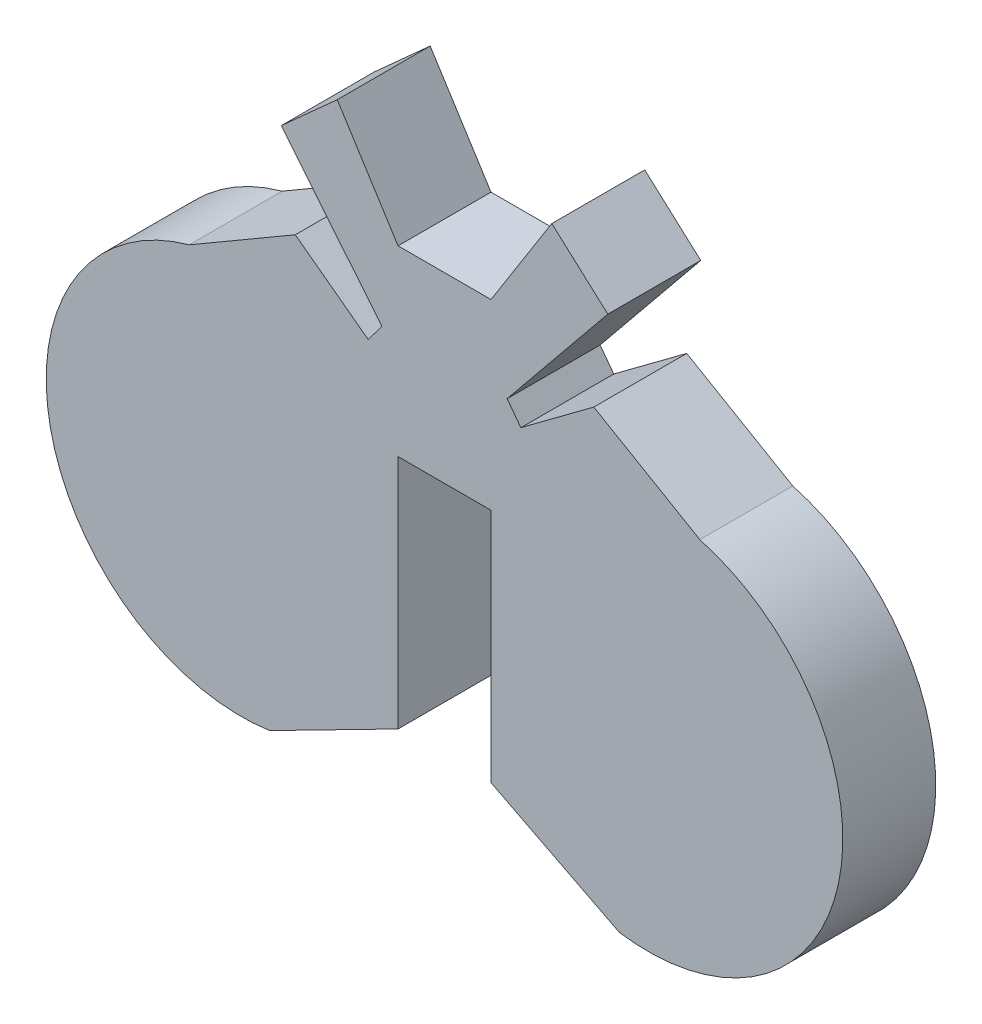
ISO-10303-21;
HEADER;
FILE_DESCRIPTION(('STEP AP214'),'2;1');
FILE_NAME('part.step','',(''),(''),'','','');
FILE_SCHEMA(('AUTOMOTIVE_DESIGN { 1 0 10303 214 1 1 1 1 }'));
ENDSEC;
DATA;
#1=APPLICATION_CONTEXT('core data for automotive mechanical design processes');
#2=APPLICATION_PROTOCOL_DEFINITION('international standard','automotive_design',2000,#1);
#3=PRODUCT_CONTEXT('',#1,'mechanical');
#4=PRODUCT('Part','Part','',(#3));
#5=PRODUCT_RELATED_PRODUCT_CATEGORY('part','',(#4));
#6=PRODUCT_DEFINITION_FORMATION('','',#4);
#7=PRODUCT_DEFINITION_CONTEXT('part definition',#1,'design');
#8=PRODUCT_DEFINITION('design','',#6,#7);
#9=PRODUCT_DEFINITION_SHAPE('','',#8);
#10=(LENGTH_UNIT() NAMED_UNIT(*) SI_UNIT(.MILLI.,.METRE.));
#11=(NAMED_UNIT(*) PLANE_ANGLE_UNIT() SI_UNIT($,.RADIAN.));
#12=(NAMED_UNIT(*) SI_UNIT($,.STERADIAN.) SOLID_ANGLE_UNIT());
#13=UNCERTAINTY_MEASURE_WITH_UNIT(LENGTH_MEASURE(1.E-05),#10,'distance_accuracy_value','');
#14=(GEOMETRIC_REPRESENTATION_CONTEXT(3) GLOBAL_UNCERTAINTY_ASSIGNED_CONTEXT((#13)) GLOBAL_UNIT_ASSIGNED_CONTEXT((#10,
#11,#12)) REPRESENTATION_CONTEXT('',''));
#15=CARTESIAN_POINT('',(0.,0.,0.));
#16=DIRECTION('',(0.,0.,1.));
#17=DIRECTION('',(1.,0.,0.));
#18=AXIS2_PLACEMENT_3D('',#15,#16,#17);
#19=CARTESIAN_POINT('',(-1.5,6.891,-3.));
#20=DIRECTION('',(0.845233853439616,0.534396606463419,0.));
#21=DIRECTION('',(-0.534396606463419,0.845233853439616,0.));
#22=AXIS2_PLACEMENT_3D('',#19,#20,#21);
#23=PLANE('',#22);
#24=DIRECTION('',(-0.534396606463419,0.845233853439616,0.));
#25=VECTOR('',#24,1.);
#26=CARTESIAN_POINT('',(-1.5,6.891,0.));
#27=LINE('',#26,#25);
#28=CARTESIAN_POINT('',(-1.5,6.891,0.));
#29=VERTEX_POINT('',#28);
#30=CARTESIAN_POINT('',(-3.46283873554014,9.99554394368371,0.));
#31=VERTEX_POINT('',#30);
#32=EDGE_CURVE('E193',#29,#31,#27,.T.);
#33=ORIENTED_EDGE('',*,*,#32,.F.);
#34=DIRECTION('',(0.,0.,1.));
#35=VECTOR('',#34,1.);
#36=CARTESIAN_POINT('',(-1.5,6.891,-3.));
#37=LINE('',#36,#35);
#38=CARTESIAN_POINT('',(-1.5,6.891,-3.));
#39=VERTEX_POINT('',#38);
#40=EDGE_CURVE('E11',#39,#29,#37,.T.);
#41=ORIENTED_EDGE('',*,*,#40,.F.);
#42=DIRECTION('',(-0.534396606463419,0.845233853439616,0.));
#43=VECTOR('',#42,1.);
#44=CARTESIAN_POINT('',(-1.5,6.891,-3.));
#45=LINE('',#44,#43);
#46=CARTESIAN_POINT('',(-3.46283873554014,9.99554394368371,-3.));
#47=VERTEX_POINT('',#46);
#48=EDGE_CURVE('E247',#39,#47,#45,.T.);
#49=ORIENTED_EDGE('',*,*,#48,.T.);
#50=DIRECTION('',(0.,0.,1.));
#51=VECTOR('',#50,1.);
#52=CARTESIAN_POINT('',(-3.46283873554014,9.99554394368371,-3.));
#53=LINE('',#52,#51);
#54=EDGE_CURVE('E35',#47,#31,#53,.T.);
#55=ORIENTED_EDGE('',*,*,#54,.T.);
#56=EDGE_LOOP('',(#33,#41,#49,#55));
#57=FACE_BOUND('',#56,.T.);
#58=ADVANCED_FACE('F32',(#57),#23,.T.);
#59=CARTESIAN_POINT('',(1.5,6.891,-3.));
#60=DIRECTION('',(0.,1.,0.));
#61=DIRECTION('',(0.,0.,1.));
#62=AXIS2_PLACEMENT_3D('',#59,#60,#61);
#63=PLANE('',#62);
#64=DIRECTION('',(-1.,0.,0.));
#65=VECTOR('',#64,1.);
#66=CARTESIAN_POINT('',(1.5,6.891,0.));
#67=LINE('',#66,#65);
#68=CARTESIAN_POINT('',(1.5,6.891,0.));
#69=VERTEX_POINT('',#68);
#70=EDGE_CURVE('E245',#69,#29,#67,.T.);
#71=ORIENTED_EDGE('',*,*,#70,.F.);
#72=DIRECTION('',(0.,0.,1.));
#73=VECTOR('',#72,1.);
#74=CARTESIAN_POINT('',(1.5,6.891,-3.));
#75=LINE('',#74,#73);
#76=CARTESIAN_POINT('',(1.5,6.891,-3.));
#77=VERTEX_POINT('',#76);
#78=EDGE_CURVE('E41',#77,#69,#75,.T.);
#79=ORIENTED_EDGE('',*,*,#78,.F.);
#80=DIRECTION('',(-1.,0.,0.));
#81=VECTOR('',#80,1.);
#82=CARTESIAN_POINT('',(1.5,6.891,-3.));
#83=LINE('',#82,#81);
#84=EDGE_CURVE('E183',#77,#39,#83,.T.);
#85=ORIENTED_EDGE('',*,*,#84,.T.);
#86=ORIENTED_EDGE('',*,*,#40,.T.);
#87=EDGE_LOOP('',(#71,#79,#85,#86));
#88=FACE_BOUND('',#87,.T.);
#89=ADVANCED_FACE('F279',(#88),#63,.T.);
#90=CARTESIAN_POINT('',(1.5,6.891,-3.));
#91=DIRECTION('',(-0.845233853439616,0.534396606463419,0.));
#92=DIRECTION('',(-0.534396606463419,-0.845233853439616,0.));
#93=AXIS2_PLACEMENT_3D('',#90,#91,#92);
#94=PLANE('',#93);
#95=DIRECTION('',(-0.534396606463419,-0.845233853439616,0.));
#96=VECTOR('',#95,1.);
#97=CARTESIAN_POINT('',(1.5,6.891,0.));
#98=LINE('',#97,#96);
#99=CARTESIAN_POINT('',(3.46283873554014,9.99554394368371,0.));
#100=VERTEX_POINT('',#99);
#101=EDGE_CURVE('E169',#100,#69,#98,.T.);
#102=ORIENTED_EDGE('',*,*,#101,.F.);
#103=DIRECTION('',(0.,0.,1.));
#104=VECTOR('',#103,1.);
#105=CARTESIAN_POINT('',(3.46283873554014,9.99554394368371,-3.));
#106=LINE('',#105,#104);
#107=CARTESIAN_POINT('',(3.46283873554014,9.99554394368371,-3.));
#108=VERTEX_POINT('',#107);
#109=EDGE_CURVE('E164',#108,#100,#106,.T.);
#110=ORIENTED_EDGE('',*,*,#109,.F.);
#111=DIRECTION('',(-0.534396606463419,-0.845233853439616,0.));
#112=VECTOR('',#111,1.);
#113=CARTESIAN_POINT('',(1.5,6.891,-3.));
#114=LINE('',#113,#112);
#115=EDGE_CURVE('E167',#108,#77,#114,.T.);
#116=ORIENTED_EDGE('',*,*,#115,.T.);
#117=ORIENTED_EDGE('',*,*,#78,.T.);
#118=EDGE_LOOP('',(#102,#110,#116,#117));
#119=FACE_BOUND('',#118,.T.);
#120=ADVANCED_FACE('F166',(#119),#94,.T.);
#121=CARTESIAN_POINT('',(3.46283873554014,9.99554394368371,-3.));
#122=DIRECTION('',(0.669519624338816,0.742794367658513,0.));
#123=DIRECTION('',(-0.742794367658513,0.669519624338817,0.));
#124=AXIS2_PLACEMENT_3D('',#121,#122,#123);
#125=PLANE('',#124);
#126=DIRECTION('',(-0.742794367658513,0.669519624338817,0.));
#127=VECTOR('',#126,1.);
#128=CARTESIAN_POINT('',(3.46283873554014,9.99554394368371,0.));
#129=LINE('',#128,#127);
#130=CARTESIAN_POINT('',(5.2700574320533,8.36660269766737,0.));
#131=VERTEX_POINT('',#130);
#132=EDGE_CURVE('E242',#131,#100,#129,.T.);
#133=ORIENTED_EDGE('',*,*,#132,.F.);
#134=DIRECTION('',(0.,0.,1.));
#135=VECTOR('',#134,1.);
#136=CARTESIAN_POINT('',(5.2700574320533,8.36660269766737,-3.));
#137=LINE('',#136,#135);
#138=CARTESIAN_POINT('',(5.2700574320533,8.36660269766737,-3.));
#139=VERTEX_POINT('',#138);
#140=EDGE_CURVE('E174',#139,#131,#137,.T.);
#141=ORIENTED_EDGE('',*,*,#140,.F.);
#142=DIRECTION('',(-0.742794367658513,0.669519624338817,0.));
#143=VECTOR('',#142,1.);
#144=CARTESIAN_POINT('',(3.46283873554014,9.99554394368371,-3.));
#145=LINE('',#144,#143);
#146=EDGE_CURVE('E181',#139,#108,#145,.T.);
#147=ORIENTED_EDGE('',*,*,#146,.T.);
#148=ORIENTED_EDGE('',*,*,#109,.T.);
#149=EDGE_LOOP('',(#133,#141,#147,#148));
#150=FACE_BOUND('',#149,.T.);
#151=ADVANCED_FACE('F185',(#150),#125,.T.);
#152=CARTESIAN_POINT('',(5.2700574320533,8.36660269766737,-3.));
#153=DIRECTION('',(0.775286336021219,-0.631609924857735,0.));
#154=DIRECTION('',(0.631609924857735,0.775286336021219,0.));
#155=AXIS2_PLACEMENT_3D('',#152,#153,#154);
#156=PLANE('',#155);
#157=DIRECTION('',(0.631609924857735,0.775286336021219,0.));
#158=VECTOR('',#157,1.);
#159=CARTESIAN_POINT('',(5.2700574320533,8.36660269766737,0.));
#160=LINE('',#159,#158);
#161=CARTESIAN_POINT('',(2.02231919843483,4.38008035784626,0.));
#162=VERTEX_POINT('',#161);
#163=EDGE_CURVE('E239',#162,#131,#160,.T.);
#164=ORIENTED_EDGE('',*,*,#163,.F.);
#165=DIRECTION('',(0.,0.,1.));
#166=VECTOR('',#165,1.);
#167=CARTESIAN_POINT('',(2.02231919843483,4.38008035784626,-3.));
#168=LINE('',#167,#166);
#169=CARTESIAN_POINT('',(2.02231919843483,4.38008035784626,-3.));
#170=VERTEX_POINT('',#169);
#171=EDGE_CURVE('E251',#170,#162,#168,.T.);
#172=ORIENTED_EDGE('',*,*,#171,.F.);
#173=DIRECTION('',(0.631609924857735,0.775286336021219,0.));
#174=VECTOR('',#173,1.);
#175=CARTESIAN_POINT('',(5.2700574320533,8.36660269766737,-3.));
#176=LINE('',#175,#174);
#177=EDGE_CURVE('E186',#170,#139,#176,.T.);
#178=ORIENTED_EDGE('',*,*,#177,.T.);
#179=ORIENTED_EDGE('',*,*,#140,.T.);
#180=EDGE_LOOP('',(#164,#172,#178,#179));
#181=FACE_BOUND('',#180,.T.);
#182=ADVANCED_FACE('F292',(#181),#156,.T.);
#183=CARTESIAN_POINT('',(2.02231919843483,4.38008035784626,-3.));
#184=DIRECTION('',(0.80205717942544,0.597247252762294,0.));
#185=DIRECTION('',(-0.597247252762294,0.80205717942544,0.));
#186=AXIS2_PLACEMENT_3D('',#183,#184,#185);
#187=PLANE('',#186);
#188=DIRECTION('',(-0.597247252762294,0.80205717942544,0.));
#189=VECTOR('',#188,1.);
#190=CARTESIAN_POINT('',(2.02231919843483,4.38008035784626,0.));
#191=LINE('',#190,#189);
#192=CARTESIAN_POINT('',(2.46249042372064,3.78896421660971,0.));
#193=VERTEX_POINT('',#192);
#194=EDGE_CURVE('E236',#193,#162,#191,.T.);
#195=ORIENTED_EDGE('',*,*,#194,.F.);
#196=DIRECTION('',(0.,0.,1.));
#197=VECTOR('',#196,1.);
#198=CARTESIAN_POINT('',(2.46249042372064,3.78896421660971,-3.));
#199=LINE('',#198,#197);
#200=CARTESIAN_POINT('',(2.46249042372064,3.78896421660971,-3.));
#201=VERTEX_POINT('',#200);
#202=EDGE_CURVE('E253',#201,#193,#199,.T.);
#203=ORIENTED_EDGE('',*,*,#202,.F.);
#204=DIRECTION('',(-0.597247252762294,0.80205717942544,0.));
#205=VECTOR('',#204,1.);
#206=CARTESIAN_POINT('',(2.02231919843483,4.38008035784626,-3.));
#207=LINE('',#206,#205);
#208=EDGE_CURVE('E188',#201,#170,#207,.T.);
#209=ORIENTED_EDGE('',*,*,#208,.T.);
#210=ORIENTED_EDGE('',*,*,#171,.T.);
#211=EDGE_LOOP('',(#195,#203,#209,#210));
#212=FACE_BOUND('',#211,.T.);
#213=ADVANCED_FACE('F295',(#212),#187,.T.);
#214=CARTESIAN_POINT('',(2.46249042372064,3.78896421660971,-3.));
#215=DIRECTION('',(-0.597247252762298,0.802057179425437,0.));
#216=DIRECTION('',(-0.802057179425437,-0.597247252762298,0.));
#217=AXIS2_PLACEMENT_3D('',#214,#215,#216);
#218=PLANE('',#217);
#219=DIRECTION('',(-0.802057179425437,-0.597247252762298,0.));
#220=VECTOR('',#219,1.);
#221=CARTESIAN_POINT('',(2.46249042372064,3.78896421660971,0.));
#222=LINE('',#221,#220);
#223=CARTESIAN_POINT('',(4.8165282453343,5.54188490346705,0.));
#224=VERTEX_POINT('',#223);
#225=EDGE_CURVE('E233',#224,#193,#222,.T.);
#226=ORIENTED_EDGE('',*,*,#225,.F.);
#227=DIRECTION('',(0.,0.,1.));
#228=VECTOR('',#227,1.);
#229=CARTESIAN_POINT('',(4.8165282453343,5.54188490346705,-3.));
#230=LINE('',#229,#228);
#231=CARTESIAN_POINT('',(4.8165282453343,5.54188490346705,-3.));
#232=VERTEX_POINT('',#231);
#233=EDGE_CURVE('E255',#232,#224,#230,.T.);
#234=ORIENTED_EDGE('',*,*,#233,.F.);
#235=DIRECTION('',(-0.802057179425437,-0.597247252762298,0.));
#236=VECTOR('',#235,1.);
#237=CARTESIAN_POINT('',(2.46249042372064,3.78896421660971,-3.));
#238=LINE('',#237,#236);
#239=EDGE_CURVE('E418',#232,#201,#238,.T.);
#240=ORIENTED_EDGE('',*,*,#239,.T.);
#241=ORIENTED_EDGE('',*,*,#202,.T.);
#242=EDGE_LOOP('',(#226,#234,#240,#241));
#243=FACE_BOUND('',#242,.T.);
#244=ADVANCED_FACE('F299',(#243),#218,.T.);
#245=CARTESIAN_POINT('',(4.8165282453343,5.54188490346705,-3.));
#246=DIRECTION('',(0.503095366919462,0.864230901891486,0.));
#247=DIRECTION('',(-0.864230901891486,0.503095366919462,0.));
#248=AXIS2_PLACEMENT_3D('',#245,#246,#247);
#249=PLANE('',#248);
#250=DIRECTION('',(-0.864230901891486,0.503095366919462,0.));
#251=VECTOR('',#250,1.);
#252=CARTESIAN_POINT('',(4.8165282453343,5.54188490346705,0.));
#253=LINE('',#252,#251);
#254=CARTESIAN_POINT('',(8.24061107862836,3.54862105973214,0.));
#255=VERTEX_POINT('',#254);
#256=EDGE_CURVE('E230',#255,#224,#253,.T.);
#257=ORIENTED_EDGE('',*,*,#256,.F.);
#258=DIRECTION('',(0.,0.,1.));
#259=VECTOR('',#258,1.);
#260=CARTESIAN_POINT('',(8.24061107862836,3.54862105973214,-3.));
#261=LINE('',#260,#259);
#262=CARTESIAN_POINT('',(8.24061107862836,3.54862105973214,-3.));
#263=VERTEX_POINT('',#262);
#264=EDGE_CURVE('E257',#263,#255,#261,.T.);
#265=ORIENTED_EDGE('',*,*,#264,.F.);
#266=DIRECTION('',(-0.864230901891486,0.503095366919462,0.));
#267=VECTOR('',#266,1.);
#268=CARTESIAN_POINT('',(4.8165282453343,5.54188490346705,-3.));
#269=LINE('',#268,#267);
#270=EDGE_CURVE('E415',#263,#232,#269,.T.);
#271=ORIENTED_EDGE('',*,*,#270,.T.);
#272=ORIENTED_EDGE('',*,*,#233,.T.);
#273=EDGE_LOOP('',(#257,#265,#271,#272));
#274=FACE_BOUND('',#273,.T.);
#275=ADVANCED_FACE('F303',(#274),#249,.T.);
#276=CARTESIAN_POINT('',(6.56888640009041,-2.51204768217804,-3.));
#277=DIRECTION('',(0.,0.,1.));
#278=DIRECTION('',(1.,0.,0.));
#279=AXIS2_PLACEMENT_3D('',#276,#277,#278);
#280=CYLINDRICAL_SURFACE('',#279,6.287);
#281=CARTESIAN_POINT('',(6.56888640009041,-2.51204768217804,0.));
#282=DIRECTION('',(0.,0.,1.));
#283=DIRECTION('',(-1.,0.,0.));
#284=AXIS2_PLACEMENT_3D('',#281,#282,#283);
#285=CIRCLE('',#284,6.287);
#286=CARTESIAN_POINT('',(5.64267455943129,-8.73044784831586,0.));
#287=VERTEX_POINT('',#286);
#288=EDGE_CURVE('E227',#287,#255,#285,.T.);
#289=ORIENTED_EDGE('',*,*,#288,.F.);
#290=DIRECTION('',(0.,0.,1.));
#291=VECTOR('',#290,1.);
#292=CARTESIAN_POINT('',(5.64267455943129,-8.73044784831586,-3.));
#293=LINE('',#292,#291);
#294=CARTESIAN_POINT('',(5.64267455943129,-8.73044784831586,-3.));
#295=VERTEX_POINT('',#294);
#296=EDGE_CURVE('E259',#295,#287,#293,.T.);
#297=ORIENTED_EDGE('',*,*,#296,.F.);
#298=CARTESIAN_POINT('',(6.56888640009041,-2.51204768217804,-3.));
#299=DIRECTION('',(0.,0.,1.));
#300=DIRECTION('',(-1.,0.,0.));
#301=AXIS2_PLACEMENT_3D('',#298,#299,#300);
#302=CIRCLE('',#301,6.287);
#303=EDGE_CURVE('E412',#295,#263,#302,.T.);
#304=ORIENTED_EDGE('',*,*,#303,.T.);
#305=ORIENTED_EDGE('',*,*,#264,.T.);
#306=EDGE_LOOP('',(#289,#297,#304,#305));
#307=FACE_BOUND('',#306,.T.);
#308=ADVANCED_FACE('F307',(#307),#280,.T.);
#309=CARTESIAN_POINT('',(1.5,-6.614,-3.));
#310=DIRECTION('',(-0.454954395596702,-0.890514737624953,0.));
#311=DIRECTION('',(0.890514737624954,-0.454954395596702,0.));
#312=AXIS2_PLACEMENT_3D('',#309,#310,#311);
#313=PLANE('',#312);
#314=DIRECTION('',(0.890514737624953,-0.454954395596702,0.));
#315=VECTOR('',#314,1.);
#316=CARTESIAN_POINT('',(1.5,-6.614,0.));
#317=LINE('',#316,#315);
#318=CARTESIAN_POINT('',(1.5,-6.614,0.));
#319=VERTEX_POINT('',#318);
#320=EDGE_CURVE('E224',#319,#287,#317,.T.);
#321=ORIENTED_EDGE('',*,*,#320,.F.);
#322=DIRECTION('',(0.,0.,1.));
#323=VECTOR('',#322,1.);
#324=CARTESIAN_POINT('',(1.5,-6.614,-3.));
#325=LINE('',#324,#323);
#326=CARTESIAN_POINT('',(1.5,-6.614,-3.));
#327=VERTEX_POINT('',#326);
#328=EDGE_CURVE('E261',#327,#319,#325,.T.);
#329=ORIENTED_EDGE('',*,*,#328,.F.);
#330=DIRECTION('',(0.890514737624953,-0.454954395596702,0.));
#331=VECTOR('',#330,1.);
#332=CARTESIAN_POINT('',(1.5,-6.614,-3.));
#333=LINE('',#332,#331);
#334=EDGE_CURVE('E409',#327,#295,#333,.T.);
#335=ORIENTED_EDGE('',*,*,#334,.T.);
#336=ORIENTED_EDGE('',*,*,#296,.T.);
#337=EDGE_LOOP('',(#321,#329,#335,#336));
#338=FACE_BOUND('',#337,.T.);
#339=ADVANCED_FACE('F311',(#338),#313,.T.);
#340=CARTESIAN_POINT('',(1.5,0.,-3.));
#341=DIRECTION('',(-1.,0.,0.));
#342=DIRECTION('',(0.,-1.,0.));
#343=AXIS2_PLACEMENT_3D('',#340,#341,#342);
#344=PLANE('',#343);
#345=DIRECTION('',(0.,-1.,0.));
#346=VECTOR('',#345,1.);
#347=CARTESIAN_POINT('',(1.5,0.,0.));
#348=LINE('',#347,#346);
#349=CARTESIAN_POINT('',(1.5,1.,0.));
#350=VERTEX_POINT('',#349);
#351=EDGE_CURVE('E221',#350,#319,#348,.T.);
#352=ORIENTED_EDGE('',*,*,#351,.F.);
#353=DIRECTION('',(0.,0.,1.));
#354=VECTOR('',#353,1.);
#355=CARTESIAN_POINT('',(1.5,1.,-10.));
#356=LINE('',#355,#354);
#357=CARTESIAN_POINT('',(1.5,1.,-3.));
#358=VERTEX_POINT('',#357);
#359=EDGE_CURVE('E366',#358,#350,#356,.T.);
#360=ORIENTED_EDGE('',*,*,#359,.F.);
#361=DIRECTION('',(0.,-1.,0.));
#362=VECTOR('',#361,1.);
#363=CARTESIAN_POINT('',(1.5,0.,-3.));
#364=LINE('',#363,#362);
#365=EDGE_CURVE('E407',#358,#327,#364,.T.);
#366=ORIENTED_EDGE('',*,*,#365,.T.);
#367=ORIENTED_EDGE('',*,*,#328,.T.);
#368=EDGE_LOOP('',(#352,#360,#366,#367));
#369=FACE_BOUND('',#368,.T.);
#370=ADVANCED_FACE('F315',(#369),#344,.T.);
#371=CARTESIAN_POINT('',(-1.5,0.,-3.));
#372=DIRECTION('',(1.,0.,0.));
#373=DIRECTION('',(0.,1.,0.));
#374=AXIS2_PLACEMENT_3D('',#371,#372,#373);
#375=PLANE('',#374);
#376=DIRECTION('',(0.,1.,0.));
#377=VECTOR('',#376,1.);
#378=CARTESIAN_POINT('',(-1.5,0.,0.));
#379=LINE('',#378,#377);
#380=CARTESIAN_POINT('',(-1.5,-6.614,0.));
#381=VERTEX_POINT('',#380);
#382=CARTESIAN_POINT('',(-1.5,1.,0.));
#383=VERTEX_POINT('',#382);
#384=EDGE_CURVE('E218',#381,#383,#379,.T.);
#385=ORIENTED_EDGE('',*,*,#384,.F.);
#386=DIRECTION('',(0.,0.,1.));
#387=VECTOR('',#386,1.);
#388=CARTESIAN_POINT('',(-1.5,-6.614,-3.));
#389=LINE('',#388,#387);
#390=CARTESIAN_POINT('',(-1.5,-6.614,-3.));
#391=VERTEX_POINT('',#390);
#392=EDGE_CURVE('E263',#391,#381,#389,.T.);
#393=ORIENTED_EDGE('',*,*,#392,.F.);
#394=DIRECTION('',(0.,1.,0.));
#395=VECTOR('',#394,1.);
#396=CARTESIAN_POINT('',(-1.5,0.,-3.));
#397=LINE('',#396,#395);
#398=CARTESIAN_POINT('',(-1.5,1.,-3.));
#399=VERTEX_POINT('',#398);
#400=EDGE_CURVE('E404',#391,#399,#397,.T.);
#401=ORIENTED_EDGE('',*,*,#400,.T.);
#402=DIRECTION('',(0.,0.,1.));
#403=VECTOR('',#402,1.);
#404=CARTESIAN_POINT('',(-1.5,1.,-10.));
#405=LINE('',#404,#403);
#406=EDGE_CURVE('E375',#399,#383,#405,.T.);
#407=ORIENTED_EDGE('',*,*,#406,.T.);
#408=EDGE_LOOP('',(#385,#393,#401,#407));
#409=FACE_BOUND('',#408,.T.);
#410=ADVANCED_FACE('F319',(#409),#375,.T.);
#411=CARTESIAN_POINT('',(-1.5,-6.614,-3.));
#412=DIRECTION('',(0.454954395596702,-0.890514737624953,0.));
#413=DIRECTION('',(0.890514737624954,0.454954395596702,0.));
#414=AXIS2_PLACEMENT_3D('',#411,#412,#413);
#415=PLANE('',#414);
#416=DIRECTION('',(0.890514737624953,0.454954395596702,0.));
#417=VECTOR('',#416,1.);
#418=CARTESIAN_POINT('',(-1.5,-6.614,0.));
#419=LINE('',#418,#417);
#420=CARTESIAN_POINT('',(-5.64267455943128,-8.73044784831586,0.));
#421=VERTEX_POINT('',#420);
#422=EDGE_CURVE('E215',#421,#381,#419,.T.);
#423=ORIENTED_EDGE('',*,*,#422,.F.);
#424=DIRECTION('',(0.,0.,1.));
#425=VECTOR('',#424,1.);
#426=CARTESIAN_POINT('',(-5.64267455943128,-8.73044784831586,-3.));
#427=LINE('',#426,#425);
#428=CARTESIAN_POINT('',(-5.64267455943128,-8.73044784831586,-3.));
#429=VERTEX_POINT('',#428);
#430=EDGE_CURVE('E265',#429,#421,#427,.T.);
#431=ORIENTED_EDGE('',*,*,#430,.F.);
#432=DIRECTION('',(0.890514737624953,0.454954395596702,0.));
#433=VECTOR('',#432,1.);
#434=CARTESIAN_POINT('',(-1.5,-6.614,-3.));
#435=LINE('',#434,#433);
#436=EDGE_CURVE('E401',#429,#391,#435,.T.);
#437=ORIENTED_EDGE('',*,*,#436,.T.);
#438=ORIENTED_EDGE('',*,*,#392,.T.);
#439=EDGE_LOOP('',(#423,#431,#437,#438));
#440=FACE_BOUND('',#439,.T.);
#441=ADVANCED_FACE('F323',(#440),#415,.T.);
#442=CARTESIAN_POINT('',(-6.56888640009041,-2.51204768217804,-3.));
#443=DIRECTION('',(0.,0.,1.));
#444=DIRECTION('',(1.,0.,0.));
#445=AXIS2_PLACEMENT_3D('',#442,#443,#444);
#446=CYLINDRICAL_SURFACE('',#445,6.287);
#447=CARTESIAN_POINT('',(-6.56888640009041,-2.51204768217804,0.));
#448=DIRECTION('',(0.,0.,1.));
#449=DIRECTION('',(1.,0.,0.));
#450=AXIS2_PLACEMENT_3D('',#447,#448,#449);
#451=CIRCLE('',#450,6.287);
#452=CARTESIAN_POINT('',(-8.24061107862836,3.54862105973214,0.));
#453=VERTEX_POINT('',#452);
#454=EDGE_CURVE('E212',#453,#421,#451,.T.);
#455=ORIENTED_EDGE('',*,*,#454,.F.);
#456=DIRECTION('',(0.,0.,1.));
#457=VECTOR('',#456,1.);
#458=CARTESIAN_POINT('',(-8.24061107862836,3.54862105973214,-3.));
#459=LINE('',#458,#457);
#460=CARTESIAN_POINT('',(-8.24061107862836,3.54862105973214,-3.));
#461=VERTEX_POINT('',#460);
#462=EDGE_CURVE('E267',#461,#453,#459,.T.);
#463=ORIENTED_EDGE('',*,*,#462,.F.);
#464=CARTESIAN_POINT('',(-6.56888640009041,-2.51204768217804,-3.));
#465=DIRECTION('',(0.,0.,1.));
#466=DIRECTION('',(1.,0.,0.));
#467=AXIS2_PLACEMENT_3D('',#464,#465,#466);
#468=CIRCLE('',#467,6.287);
#469=EDGE_CURVE('E398',#461,#429,#468,.T.);
#470=ORIENTED_EDGE('',*,*,#469,.T.);
#471=ORIENTED_EDGE('',*,*,#430,.T.);
#472=EDGE_LOOP('',(#455,#463,#470,#471));
#473=FACE_BOUND('',#472,.T.);
#474=ADVANCED_FACE('F327',(#473),#446,.T.);
#475=CARTESIAN_POINT('',(-4.8165282453343,5.54188490346705,-3.));
#476=DIRECTION('',(-0.503095366919462,0.864230901891486,0.));
#477=DIRECTION('',(-0.864230901891486,-0.503095366919462,0.));
#478=AXIS2_PLACEMENT_3D('',#475,#476,#477);
#479=PLANE('',#478);
#480=DIRECTION('',(-0.864230901891486,-0.503095366919462,0.));
#481=VECTOR('',#480,1.);
#482=CARTESIAN_POINT('',(-4.8165282453343,5.54188490346705,0.));
#483=LINE('',#482,#481);
#484=CARTESIAN_POINT('',(-4.8165282453343,5.54188490346705,0.));
#485=VERTEX_POINT('',#484);
#486=EDGE_CURVE('E209',#485,#453,#483,.T.);
#487=ORIENTED_EDGE('',*,*,#486,.F.);
#488=DIRECTION('',(0.,0.,1.));
#489=VECTOR('',#488,1.);
#490=CARTESIAN_POINT('',(-4.8165282453343,5.54188490346705,-3.));
#491=LINE('',#490,#489);
#492=CARTESIAN_POINT('',(-4.8165282453343,5.54188490346705,-3.));
#493=VERTEX_POINT('',#492);
#494=EDGE_CURVE('E269',#493,#485,#491,.T.);
#495=ORIENTED_EDGE('',*,*,#494,.F.);
#496=DIRECTION('',(-0.864230901891486,-0.503095366919462,0.));
#497=VECTOR('',#496,1.);
#498=CARTESIAN_POINT('',(-4.8165282453343,5.54188490346705,-3.));
#499=LINE('',#498,#497);
#500=EDGE_CURVE('E395',#493,#461,#499,.T.);
#501=ORIENTED_EDGE('',*,*,#500,.T.);
#502=ORIENTED_EDGE('',*,*,#462,.T.);
#503=EDGE_LOOP('',(#487,#495,#501,#502));
#504=FACE_BOUND('',#503,.T.);
#505=ADVANCED_FACE('F331',(#504),#479,.T.);
#506=CARTESIAN_POINT('',(-2.46249042372064,3.78896421660971,-3.));
#507=DIRECTION('',(0.597247252762298,0.802057179425437,0.));
#508=DIRECTION('',(-0.802057179425437,0.597247252762298,0.));
#509=AXIS2_PLACEMENT_3D('',#506,#507,#508);
#510=PLANE('',#509);
#511=DIRECTION('',(-0.802057179425437,0.597247252762298,0.));
#512=VECTOR('',#511,1.);
#513=CARTESIAN_POINT('',(-2.46249042372064,3.78896421660971,0.));
#514=LINE('',#513,#512);
#515=CARTESIAN_POINT('',(-2.46249042372064,3.78896421660971,0.));
#516=VERTEX_POINT('',#515);
#517=EDGE_CURVE('E206',#516,#485,#514,.T.);
#518=ORIENTED_EDGE('',*,*,#517,.F.);
#519=DIRECTION('',(0.,0.,1.));
#520=VECTOR('',#519,1.);
#521=CARTESIAN_POINT('',(-2.46249042372064,3.78896421660971,-3.));
#522=LINE('',#521,#520);
#523=CARTESIAN_POINT('',(-2.46249042372064,3.78896421660971,-3.));
#524=VERTEX_POINT('',#523);
#525=EDGE_CURVE('E271',#524,#516,#522,.T.);
#526=ORIENTED_EDGE('',*,*,#525,.F.);
#527=DIRECTION('',(-0.802057179425437,0.597247252762298,0.));
#528=VECTOR('',#527,1.);
#529=CARTESIAN_POINT('',(-2.46249042372064,3.78896421660971,-3.));
#530=LINE('',#529,#528);
#531=EDGE_CURVE('E392',#524,#493,#530,.T.);
#532=ORIENTED_EDGE('',*,*,#531,.T.);
#533=ORIENTED_EDGE('',*,*,#494,.T.);
#534=EDGE_LOOP('',(#518,#526,#532,#533));
#535=FACE_BOUND('',#534,.T.);
#536=ADVANCED_FACE('F335',(#535),#510,.T.);
#537=CARTESIAN_POINT('',(-2.02231919843483,4.38008035784626,-3.));
#538=DIRECTION('',(-0.80205717942544,0.597247252762294,0.));
#539=DIRECTION('',(-0.597247252762294,-0.80205717942544,0.));
#540=AXIS2_PLACEMENT_3D('',#537,#538,#539);
#541=PLANE('',#540);
#542=DIRECTION('',(-0.597247252762294,-0.80205717942544,0.));
#543=VECTOR('',#542,1.);
#544=CARTESIAN_POINT('',(-2.02231919843483,4.38008035784626,0.));
#545=LINE('',#544,#543);
#546=CARTESIAN_POINT('',(-2.02231919843483,4.38008035784626,0.));
#547=VERTEX_POINT('',#546);
#548=EDGE_CURVE('E203',#547,#516,#545,.T.);
#549=ORIENTED_EDGE('',*,*,#548,.F.);
#550=DIRECTION('',(0.,0.,1.));
#551=VECTOR('',#550,1.);
#552=CARTESIAN_POINT('',(-2.02231919843483,4.38008035784626,-3.));
#553=LINE('',#552,#551);
#554=CARTESIAN_POINT('',(-2.02231919843483,4.38008035784626,-3.));
#555=VERTEX_POINT('',#554);
#556=EDGE_CURVE('E273',#555,#547,#553,.T.);
#557=ORIENTED_EDGE('',*,*,#556,.F.);
#558=DIRECTION('',(-0.597247252762294,-0.80205717942544,0.));
#559=VECTOR('',#558,1.);
#560=CARTESIAN_POINT('',(-2.02231919843483,4.38008035784626,-3.));
#561=LINE('',#560,#559);
#562=EDGE_CURVE('E389',#555,#524,#561,.T.);
#563=ORIENTED_EDGE('',*,*,#562,.T.);
#564=ORIENTED_EDGE('',*,*,#525,.T.);
#565=EDGE_LOOP('',(#549,#557,#563,#564));
#566=FACE_BOUND('',#565,.T.);
#567=ADVANCED_FACE('F339',(#566),#541,.T.);
#568=CARTESIAN_POINT('',(-5.2700574320533,8.36660269766737,-3.));
#569=DIRECTION('',(-0.775286336021219,-0.631609924857735,0.));
#570=DIRECTION('',(0.631609924857735,-0.775286336021219,0.));
#571=AXIS2_PLACEMENT_3D('',#568,#569,#570);
#572=PLANE('',#571);
#573=DIRECTION('',(0.631609924857735,-0.775286336021219,0.));
#574=VECTOR('',#573,1.);
#575=CARTESIAN_POINT('',(-5.2700574320533,8.36660269766737,0.));
#576=LINE('',#575,#574);
#577=CARTESIAN_POINT('',(-5.2700574320533,8.36660269766737,0.));
#578=VERTEX_POINT('',#577);
#579=EDGE_CURVE('E200',#578,#547,#576,.T.);
#580=ORIENTED_EDGE('',*,*,#579,.F.);
#581=DIRECTION('',(0.,0.,1.));
#582=VECTOR('',#581,1.);
#583=CARTESIAN_POINT('',(-5.2700574320533,8.36660269766737,-3.));
#584=LINE('',#583,#582);
#585=CARTESIAN_POINT('',(-5.2700574320533,8.36660269766737,-3.));
#586=VERTEX_POINT('',#585);
#587=EDGE_CURVE('E274',#586,#578,#584,.T.);
#588=ORIENTED_EDGE('',*,*,#587,.F.);
#589=DIRECTION('',(0.631609924857735,-0.775286336021219,0.));
#590=VECTOR('',#589,1.);
#591=CARTESIAN_POINT('',(-5.2700574320533,8.36660269766737,-3.));
#592=LINE('',#591,#590);
#593=EDGE_CURVE('E386',#586,#555,#592,.T.);
#594=ORIENTED_EDGE('',*,*,#593,.T.);
#595=ORIENTED_EDGE('',*,*,#556,.T.);
#596=EDGE_LOOP('',(#580,#588,#594,#595));
#597=FACE_BOUND('',#596,.T.);
#598=ADVANCED_FACE('F343',(#597),#572,.T.);
#599=CARTESIAN_POINT('',(-3.46283873554014,9.99554394368371,-3.));
#600=DIRECTION('',(-0.669519624338816,0.742794367658513,0.));
#601=DIRECTION('',(-0.742794367658513,-0.669519624338817,0.));
#602=AXIS2_PLACEMENT_3D('',#599,#600,#601);
#603=PLANE('',#602);
#604=DIRECTION('',(-0.742794367658513,-0.669519624338817,0.));
#605=VECTOR('',#604,1.);
#606=CARTESIAN_POINT('',(-3.46283873554014,9.99554394368371,0.));
#607=LINE('',#606,#605);
#608=EDGE_CURVE('E196',#31,#578,#607,.T.);
#609=ORIENTED_EDGE('',*,*,#608,.F.);
#610=ORIENTED_EDGE('',*,*,#54,.F.);
#611=DIRECTION('',(-0.742794367658513,-0.669519624338817,0.));
#612=VECTOR('',#611,1.);
#613=CARTESIAN_POINT('',(-3.46283873554014,9.99554394368371,-3.));
#614=LINE('',#613,#612);
#615=EDGE_CURVE('E384',#47,#586,#614,.T.);
#616=ORIENTED_EDGE('',*,*,#615,.T.);
#617=ORIENTED_EDGE('',*,*,#587,.T.);
#618=EDGE_LOOP('',(#609,#610,#616,#617));
#619=FACE_BOUND('',#618,.T.);
#620=ADVANCED_FACE('F276',(#619),#603,.T.);
#621=CARTESIAN_POINT('',(-6.56888640009041,-2.51204768217804,-3.));
#622=DIRECTION('',(0.,0.,1.));
#623=DIRECTION('',(1.,0.,0.));
#624=AXIS2_PLACEMENT_3D('',#621,#622,#623);
#625=PLANE('',#624);
#626=DIRECTION('',(-1.,0.,0.));
#627=VECTOR('',#626,1.);
#628=CARTESIAN_POINT('',(-6.56888640009041,1.,-3.));
#629=LINE('',#628,#627);
#630=EDGE_CURVE('E197',#358,#399,#629,.T.);
#631=ORIENTED_EDGE('',*,*,#630,.T.);
#632=ORIENTED_EDGE('',*,*,#400,.F.);
#633=ORIENTED_EDGE('',*,*,#436,.F.);
#634=ORIENTED_EDGE('',*,*,#469,.F.);
#635=ORIENTED_EDGE('',*,*,#500,.F.);
#636=ORIENTED_EDGE('',*,*,#531,.F.);
#637=ORIENTED_EDGE('',*,*,#562,.F.);
#638=ORIENTED_EDGE('',*,*,#593,.F.);
#639=ORIENTED_EDGE('',*,*,#615,.F.);
#640=ORIENTED_EDGE('',*,*,#48,.F.);
#641=ORIENTED_EDGE('',*,*,#84,.F.);
#642=ORIENTED_EDGE('',*,*,#115,.F.);
#643=ORIENTED_EDGE('',*,*,#146,.F.);
#644=ORIENTED_EDGE('',*,*,#177,.F.);
#645=ORIENTED_EDGE('',*,*,#208,.F.);
#646=ORIENTED_EDGE('',*,*,#239,.F.);
#647=ORIENTED_EDGE('',*,*,#270,.F.);
#648=ORIENTED_EDGE('',*,*,#303,.F.);
#649=ORIENTED_EDGE('',*,*,#334,.F.);
#650=ORIENTED_EDGE('',*,*,#365,.F.);
#651=EDGE_LOOP('',(#631,#632,#633,#634,#635,#636,#637,#638,#639,#640,#641,#642,#643,#644,#645,
#646,#647,#648,#649,#650));
#652=FACE_BOUND('',#651,.T.);
#653=ADVANCED_FACE('F179',(#652),#625,.F.);
#654=CARTESIAN_POINT('',(-6.56888640009041,-2.51204768217804,0.));
#655=DIRECTION('',(0.,0.,1.));
#656=DIRECTION('',(1.,0.,0.));
#657=AXIS2_PLACEMENT_3D('',#654,#655,#656);
#658=PLANE('',#657);
#659=ORIENTED_EDGE('',*,*,#384,.T.);
#660=DIRECTION('',(-1.,0.,0.));
#661=VECTOR('',#660,1.);
#662=CARTESIAN_POINT('',(-1.5,1.,0.));
#663=LINE('',#662,#661);
#664=EDGE_CURVE('E370',#350,#383,#663,.T.);
#665=ORIENTED_EDGE('',*,*,#664,.F.);
#666=ORIENTED_EDGE('',*,*,#351,.T.);
#667=ORIENTED_EDGE('',*,*,#320,.T.);
#668=ORIENTED_EDGE('',*,*,#288,.T.);
#669=ORIENTED_EDGE('',*,*,#256,.T.);
#670=ORIENTED_EDGE('',*,*,#225,.T.);
#671=ORIENTED_EDGE('',*,*,#194,.T.);
#672=ORIENTED_EDGE('',*,*,#163,.T.);
#673=ORIENTED_EDGE('',*,*,#132,.T.);
#674=ORIENTED_EDGE('',*,*,#101,.T.);
#675=ORIENTED_EDGE('',*,*,#70,.T.);
#676=ORIENTED_EDGE('',*,*,#32,.T.);
#677=ORIENTED_EDGE('',*,*,#608,.T.);
#678=ORIENTED_EDGE('',*,*,#579,.T.);
#679=ORIENTED_EDGE('',*,*,#548,.T.);
#680=ORIENTED_EDGE('',*,*,#517,.T.);
#681=ORIENTED_EDGE('',*,*,#486,.T.);
#682=ORIENTED_EDGE('',*,*,#454,.T.);
#683=ORIENTED_EDGE('',*,*,#422,.T.);
#684=EDGE_LOOP('',(#659,#665,#666,#667,#668,#669,#670,#671,#672,#673,#674,#675,#676,#677,#678,
#679,#680,#681,#682,#683));
#685=FACE_BOUND('',#684,.T.);
#686=ADVANCED_FACE('F278',(#685),#658,.T.);
#687=CARTESIAN_POINT('',(-1.5,1.,-10.));
#688=DIRECTION('',(0.,1.,0.));
#689=DIRECTION('',(0.,0.,1.));
#690=AXIS2_PLACEMENT_3D('',#687,#688,#689);
#691=PLANE('',#690);
#692=ORIENTED_EDGE('',*,*,#359,.T.);
#693=ORIENTED_EDGE('',*,*,#664,.T.);
#694=ORIENTED_EDGE('',*,*,#406,.F.);
#695=ORIENTED_EDGE('',*,*,#630,.F.);
#696=EDGE_LOOP('',(#692,#693,#694,#695));
#697=FACE_BOUND('',#696,.T.);
#698=ADVANCED_FACE('F355',(#697),#691,.F.);
#699=CLOSED_SHELL('',(#58,#89,#120,#151,#182,#213,#244,#275,#308,#339,#370,#410,#441,#474,#505,
#536,#567,#598,#620,#653,#686,#698));
#700=MANIFOLD_SOLID_BREP('B2',#699);
#701=ADVANCED_BREP_SHAPE_REPRESENTATION('',(#18,#700),#14);
#702=SHAPE_DEFINITION_REPRESENTATION(#9,#701);
ENDSEC;
END-ISO-10303-21;
